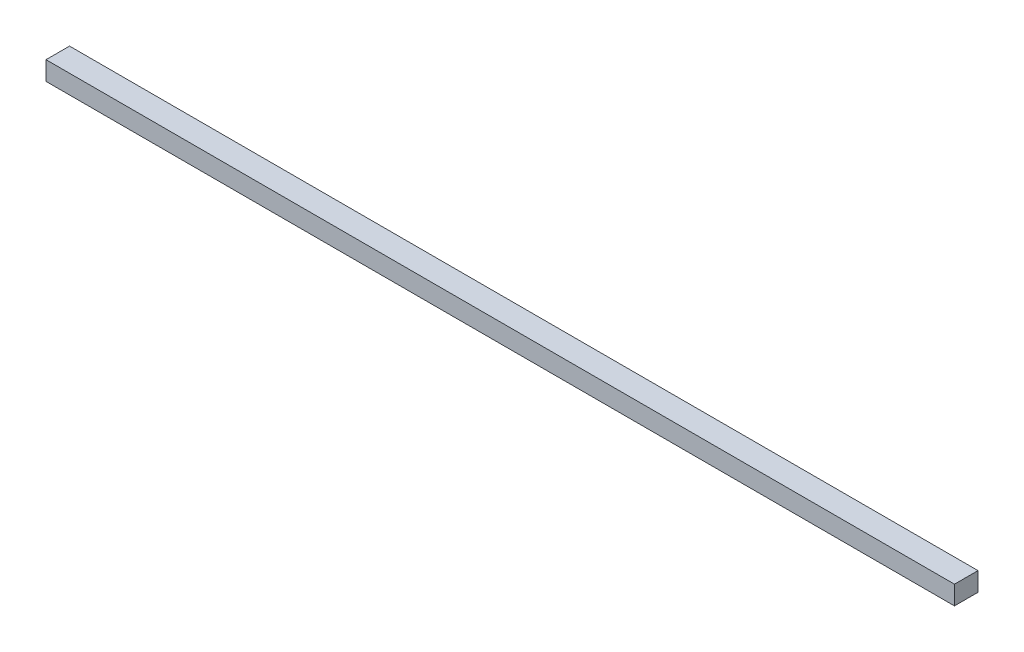
ISO-10303-21;
HEADER;
FILE_DESCRIPTION(('STEP AP214'),'2;1');
FILE_NAME('part.step','',(''),(''),'','','');
FILE_SCHEMA(('AUTOMOTIVE_DESIGN { 1 0 10303 214 1 1 1 1 }'));
ENDSEC;
DATA;
#1=APPLICATION_CONTEXT('core data for automotive mechanical design processes');
#2=APPLICATION_PROTOCOL_DEFINITION('international standard','automotive_design',2000,#1);
#3=PRODUCT_CONTEXT('',#1,'mechanical');
#4=PRODUCT('Part','Part','',(#3));
#5=PRODUCT_RELATED_PRODUCT_CATEGORY('part','',(#4));
#6=PRODUCT_DEFINITION_FORMATION('','',#4);
#7=PRODUCT_DEFINITION_CONTEXT('part definition',#1,'design');
#8=PRODUCT_DEFINITION('design','',#6,#7);
#9=PRODUCT_DEFINITION_SHAPE('','',#8);
#10=(LENGTH_UNIT() NAMED_UNIT(*) SI_UNIT(.MILLI.,.METRE.));
#11=(NAMED_UNIT(*) PLANE_ANGLE_UNIT() SI_UNIT($,.RADIAN.));
#12=(NAMED_UNIT(*) SI_UNIT($,.STERADIAN.) SOLID_ANGLE_UNIT());
#13=UNCERTAINTY_MEASURE_WITH_UNIT(LENGTH_MEASURE(1.E-05),#10,'distance_accuracy_value','');
#14=(GEOMETRIC_REPRESENTATION_CONTEXT(3) GLOBAL_UNCERTAINTY_ASSIGNED_CONTEXT((#13)) GLOBAL_UNIT_ASSIGNED_CONTEXT((#10,
#11,#12)) REPRESENTATION_CONTEXT('',''));
#15=CARTESIAN_POINT('',(0.,0.,0.));
#16=DIRECTION('',(0.,0.,1.));
#17=DIRECTION('',(1.,0.,0.));
#18=AXIS2_PLACEMENT_3D('',#15,#16,#17);
#19=CARTESIAN_POINT('',(-964.999999999999,-20.0000000000001,50.));
#20=DIRECTION('',(1.,0.,0.));
#21=DIRECTION('',(0.,0.,-1.));
#22=AXIS2_PLACEMENT_3D('',#19,#20,#21);
#23=PLANE('',#22);
#24=DIRECTION('',(0.,-1.,0.));
#25=VECTOR('',#24,1.);
#26=CARTESIAN_POINT('',(-964.999999999999,-20.0000000000001,0.));
#27=LINE('',#26,#25);
#28=CARTESIAN_POINT('',(-964.999999999999,19.9999999999999,0.));
#29=VERTEX_POINT('',#28);
#30=CARTESIAN_POINT('',(-964.999999999999,-20.0000000000001,0.));
#31=VERTEX_POINT('',#30);
#32=EDGE_CURVE('E102',#29,#31,#27,.T.);
#33=ORIENTED_EDGE('',*,*,#32,.T.);
#34=DIRECTION('',(0.,0.,-1.));
#35=VECTOR('',#34,1.);
#36=CARTESIAN_POINT('',(-964.999999999999,-20.0000000000001,50.));
#37=LINE('',#36,#35);
#38=CARTESIAN_POINT('',(-964.999999999999,-20.0000000000001,50.));
#39=VERTEX_POINT('',#38);
#40=EDGE_CURVE('E11',#39,#31,#37,.T.);
#41=ORIENTED_EDGE('',*,*,#40,.F.);
#42=DIRECTION('',(0.,-1.,0.));
#43=VECTOR('',#42,1.);
#44=CARTESIAN_POINT('',(-964.999999999999,-20.0000000000001,50.));
#45=LINE('',#44,#43);
#46=CARTESIAN_POINT('',(-964.999999999999,19.9999999999999,50.));
#47=VERTEX_POINT('',#46);
#48=EDGE_CURVE('E90',#47,#39,#45,.T.);
#49=ORIENTED_EDGE('',*,*,#48,.F.);
#50=DIRECTION('',(0.,0.,-1.));
#51=VECTOR('',#50,1.);
#52=CARTESIAN_POINT('',(-964.999999999999,19.9999999999999,50.));
#53=LINE('',#52,#51);
#54=EDGE_CURVE('E98',#47,#29,#53,.T.);
#55=ORIENTED_EDGE('',*,*,#54,.T.);
#56=EDGE_LOOP('',(#33,#41,#49,#55));
#57=FACE_BOUND('',#56,.T.);
#58=ADVANCED_FACE('F39',(#57),#23,.F.);
#59=CARTESIAN_POINT('',(965.000000000001,-19.9999999999999,50.));
#60=DIRECTION('',(0.,1.,0.));
#61=DIRECTION('',(-1.,0.,0.));
#62=AXIS2_PLACEMENT_3D('',#59,#60,#61);
#63=PLANE('',#62);
#64=DIRECTION('',(1.,0.,0.));
#65=VECTOR('',#64,1.);
#66=CARTESIAN_POINT('',(965.000000000001,-19.9999999999999,0.));
#67=LINE('',#66,#65);
#68=CARTESIAN_POINT('',(965.000000000001,-19.9999999999999,0.));
#69=VERTEX_POINT('',#68);
#70=EDGE_CURVE('E94',#31,#69,#67,.T.);
#71=ORIENTED_EDGE('',*,*,#70,.T.);
#72=DIRECTION('',(0.,0.,-1.));
#73=VECTOR('',#72,1.);
#74=CARTESIAN_POINT('',(965.000000000001,-19.9999999999999,50.));
#75=LINE('',#74,#73);
#76=CARTESIAN_POINT('',(965.000000000001,-19.9999999999999,50.));
#77=VERTEX_POINT('',#76);
#78=EDGE_CURVE('E47',#77,#69,#75,.T.);
#79=ORIENTED_EDGE('',*,*,#78,.F.);
#80=DIRECTION('',(1.,0.,0.));
#81=VECTOR('',#80,1.);
#82=CARTESIAN_POINT('',(965.000000000001,-19.9999999999999,50.));
#83=LINE('',#82,#81);
#84=EDGE_CURVE('E85',#39,#77,#83,.T.);
#85=ORIENTED_EDGE('',*,*,#84,.F.);
#86=ORIENTED_EDGE('',*,*,#40,.T.);
#87=EDGE_LOOP('',(#71,#79,#85,#86));
#88=FACE_BOUND('',#87,.T.);
#89=ADVANCED_FACE('F93',(#88),#63,.F.);
#90=CARTESIAN_POINT('',(965.000000000001,-19.9999999999999,50.));
#91=DIRECTION('',(-1.,0.,0.));
#92=DIRECTION('',(0.,0.,1.));
#93=AXIS2_PLACEMENT_3D('',#90,#91,#92);
#94=PLANE('',#93);
#95=DIRECTION('',(0.,1.,0.));
#96=VECTOR('',#95,1.);
#97=CARTESIAN_POINT('',(965.000000000001,-19.9999999999999,0.));
#98=LINE('',#97,#96);
#99=CARTESIAN_POINT('',(965.000000000001,20.0000000000001,0.));
#100=VERTEX_POINT('',#99);
#101=EDGE_CURVE('E72',#69,#100,#98,.T.);
#102=ORIENTED_EDGE('',*,*,#101,.T.);
#103=DIRECTION('',(0.,0.,-1.));
#104=VECTOR('',#103,1.);
#105=CARTESIAN_POINT('',(965.000000000001,20.0000000000001,50.));
#106=LINE('',#105,#104);
#107=CARTESIAN_POINT('',(965.000000000001,20.0000000000001,50.));
#108=VERTEX_POINT('',#107);
#109=EDGE_CURVE('E95',#108,#100,#106,.T.);
#110=ORIENTED_EDGE('',*,*,#109,.F.);
#111=DIRECTION('',(0.,1.,0.));
#112=VECTOR('',#111,1.);
#113=CARTESIAN_POINT('',(965.000000000001,-19.9999999999999,50.));
#114=LINE('',#113,#112);
#115=EDGE_CURVE('E88',#77,#108,#114,.T.);
#116=ORIENTED_EDGE('',*,*,#115,.F.);
#117=ORIENTED_EDGE('',*,*,#78,.T.);
#118=EDGE_LOOP('',(#102,#110,#116,#117));
#119=FACE_BOUND('',#118,.T.);
#120=ADVANCED_FACE('F96',(#119),#94,.F.);
#121=CARTESIAN_POINT('',(965.000000000001,20.0000000000001,50.));
#122=DIRECTION('',(0.,-1.,0.));
#123=DIRECTION('',(1.,0.,0.));
#124=AXIS2_PLACEMENT_3D('',#121,#122,#123);
#125=PLANE('',#124);
#126=DIRECTION('',(-1.,0.,0.));
#127=VECTOR('',#126,1.);
#128=CARTESIAN_POINT('',(965.000000000001,20.0000000000001,0.));
#129=LINE('',#128,#127);
#130=EDGE_CURVE('E78',#100,#29,#129,.T.);
#131=ORIENTED_EDGE('',*,*,#130,.T.);
#132=ORIENTED_EDGE('',*,*,#54,.F.);
#133=DIRECTION('',(-1.,0.,0.));
#134=VECTOR('',#133,1.);
#135=CARTESIAN_POINT('',(965.000000000001,20.0000000000001,50.));
#136=LINE('',#135,#134);
#137=EDGE_CURVE('E55',#108,#47,#136,.T.);
#138=ORIENTED_EDGE('',*,*,#137,.F.);
#139=ORIENTED_EDGE('',*,*,#109,.T.);
#140=EDGE_LOOP('',(#131,#132,#138,#139));
#141=FACE_BOUND('',#140,.T.);
#142=ADVANCED_FACE('F109',(#141),#125,.F.);
#143=CARTESIAN_POINT('',(0.,0.,50.));
#144=DIRECTION('',(0.,0.,1.));
#145=DIRECTION('',(1.,0.,0.));
#146=AXIS2_PLACEMENT_3D('',#143,#144,#145);
#147=PLANE('',#146);
#148=ORIENTED_EDGE('',*,*,#48,.T.);
#149=ORIENTED_EDGE('',*,*,#84,.T.);
#150=ORIENTED_EDGE('',*,*,#115,.T.);
#151=ORIENTED_EDGE('',*,*,#137,.T.);
#152=EDGE_LOOP('',(#148,#149,#150,#151));
#153=FACE_BOUND('',#152,.T.);
#154=ADVANCED_FACE('F86',(#153),#147,.T.);
#155=CARTESIAN_POINT('',(0.,0.,0.));
#156=DIRECTION('',(0.,0.,1.));
#157=DIRECTION('',(1.,0.,0.));
#158=AXIS2_PLACEMENT_3D('',#155,#156,#157);
#159=PLANE('',#158);
#160=ORIENTED_EDGE('',*,*,#32,.F.);
#161=ORIENTED_EDGE('',*,*,#130,.F.);
#162=ORIENTED_EDGE('',*,*,#101,.F.);
#163=ORIENTED_EDGE('',*,*,#70,.F.);
#164=EDGE_LOOP('',(#160,#161,#162,#163));
#165=FACE_BOUND('',#164,.T.);
#166=ADVANCED_FACE('F112',(#165),#159,.F.);
#167=CLOSED_SHELL('',(#58,#89,#120,#142,#154,#166));
#168=MANIFOLD_SOLID_BREP('B2',#167);
#169=ADVANCED_BREP_SHAPE_REPRESENTATION('',(#18,#168),#14);
#170=SHAPE_DEFINITION_REPRESENTATION(#9,#169);
ENDSEC;
END-ISO-10303-21;
